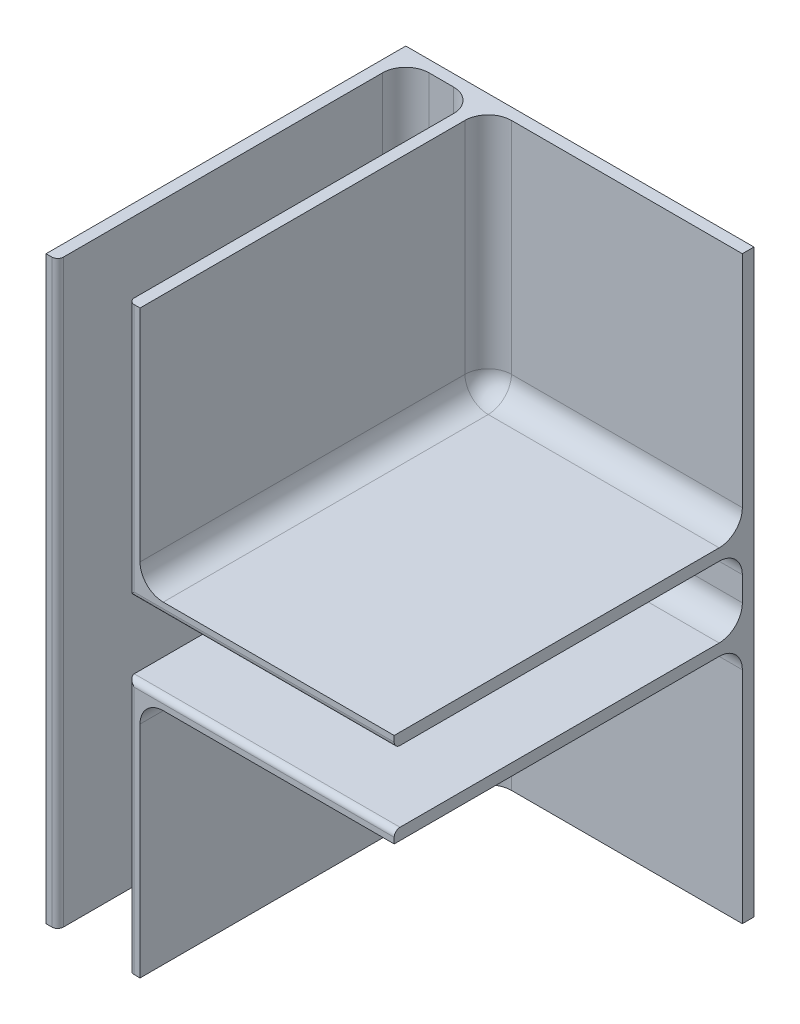
ISO-10303-21;
HEADER;
FILE_DESCRIPTION(('STEP AP214'),'2;1');
FILE_NAME('part.step','',(''),(''),'','','');
FILE_SCHEMA(('AUTOMOTIVE_DESIGN { 1 0 10303 214 1 1 1 1 }'));
ENDSEC;
DATA;
#1=APPLICATION_CONTEXT('core data for automotive mechanical design processes');
#2=APPLICATION_PROTOCOL_DEFINITION('international standard','automotive_design',2000,#1);
#3=PRODUCT_CONTEXT('',#1,'mechanical');
#4=PRODUCT('Part','Part','',(#3));
#5=PRODUCT_RELATED_PRODUCT_CATEGORY('part','',(#4));
#6=PRODUCT_DEFINITION_FORMATION('','',#4);
#7=PRODUCT_DEFINITION_CONTEXT('part definition',#1,'design');
#8=PRODUCT_DEFINITION('design','',#6,#7);
#9=PRODUCT_DEFINITION_SHAPE('','',#8);
#10=(LENGTH_UNIT() NAMED_UNIT(*) SI_UNIT(.MILLI.,.METRE.));
#11=(NAMED_UNIT(*) PLANE_ANGLE_UNIT() SI_UNIT($,.RADIAN.));
#12=(NAMED_UNIT(*) SI_UNIT($,.STERADIAN.) SOLID_ANGLE_UNIT());
#13=UNCERTAINTY_MEASURE_WITH_UNIT(LENGTH_MEASURE(1.E-05),#10,'distance_accuracy_value','');
#14=(GEOMETRIC_REPRESENTATION_CONTEXT(3) GLOBAL_UNCERTAINTY_ASSIGNED_CONTEXT((#13)) GLOBAL_UNIT_ASSIGNED_CONTEXT((#10,
#11,#12)) REPRESENTATION_CONTEXT('',''));
#15=CARTESIAN_POINT('',(0.,0.,0.));
#16=DIRECTION('',(0.,0.,1.));
#17=DIRECTION('',(1.,0.,0.));
#18=AXIS2_PLACEMENT_3D('',#15,#16,#17);
#19=CARTESIAN_POINT('',(0.,0.,1.));
#20=DIRECTION('',(0.,0.,-1.));
#21=DIRECTION('',(-1.,0.,0.));
#22=AXIS2_PLACEMENT_3D('',#19,#20,#21);
#23=PLANE('',#22);
#24=DIRECTION('',(-1.,0.,0.));
#25=VECTOR('',#24,1.);
#26=CARTESIAN_POINT('',(0.,50.,1.));
#27=LINE('',#26,#25);
#28=CARTESIAN_POINT('',(5.1,50.,1.));
#29=VERTEX_POINT('',#28);
#30=CARTESIAN_POINT('',(3.,50.,1.));
#31=VERTEX_POINT('',#30);
#32=EDGE_CURVE('E319',#29,#31,#27,.T.);
#33=ORIENTED_EDGE('',*,*,#32,.T.);
#34=DIRECTION('',(0.,1.,0.));
#35=VECTOR('',#34,1.);
#36=CARTESIAN_POINT('',(3.00000000000001,0.,1.));
#37=LINE('',#36,#35);
#38=CARTESIAN_POINT('',(3.00000000000001,0.,1.));
#39=VERTEX_POINT('',#38);
#40=EDGE_CURVE('E355',#31,#39,#37,.F.);
#41=ORIENTED_EDGE('',*,*,#40,.T.);
#42=DIRECTION('',(1.,0.,0.));
#43=VECTOR('',#42,1.);
#44=CARTESIAN_POINT('',(0.,0.,1.));
#45=LINE('',#44,#43);
#46=CARTESIAN_POINT('',(5.1,0.,1.));
#47=VERTEX_POINT('',#46);
#48=EDGE_CURVE('E314',#39,#47,#45,.T.);
#49=ORIENTED_EDGE('',*,*,#48,.T.);
#50=DIRECTION('',(0.,-1.,0.));
#51=VECTOR('',#50,1.);
#52=CARTESIAN_POINT('',(5.1,21.95,1.));
#53=LINE('',#52,#51);
#54=CARTESIAN_POINT('',(5.1,23.95,1.));
#55=VERTEX_POINT('',#54);
#56=EDGE_CURVE('E353',#47,#55,#53,.F.);
#57=ORIENTED_EDGE('',*,*,#56,.T.);
#58=DIRECTION('',(-1.,0.,0.));
#59=VECTOR('',#58,1.);
#60=CARTESIAN_POINT('',(30.,23.95,1.));
#61=LINE('',#60,#59);
#62=CARTESIAN_POINT('',(30.,23.95,1.));
#63=VERTEX_POINT('',#62);
#64=EDGE_CURVE('E351',#55,#63,#61,.F.);
#65=ORIENTED_EDGE('',*,*,#64,.T.);
#66=DIRECTION('',(0.,1.,0.));
#67=VECTOR('',#66,1.);
#68=CARTESIAN_POINT('',(30.,0.,1.));
#69=LINE('',#68,#67);
#70=CARTESIAN_POINT('',(30.,26.05,1.));
#71=VERTEX_POINT('',#70);
#72=EDGE_CURVE('E320',#63,#71,#69,.T.);
#73=ORIENTED_EDGE('',*,*,#72,.T.);
#74=DIRECTION('',(1.,0.,0.));
#75=VECTOR('',#74,1.);
#76=CARTESIAN_POINT('',(7.1,26.05,1.));
#77=LINE('',#76,#75);
#78=CARTESIAN_POINT('',(5.1,26.05,1.));
#79=VERTEX_POINT('',#78);
#80=EDGE_CURVE('E347',#71,#79,#77,.F.);
#81=ORIENTED_EDGE('',*,*,#80,.T.);
#82=DIRECTION('',(0.,-1.,0.));
#83=VECTOR('',#82,1.);
#84=CARTESIAN_POINT('',(5.1,50.,1.));
#85=LINE('',#84,#83);
#86=EDGE_CURVE('E349',#79,#29,#85,.F.);
#87=ORIENTED_EDGE('',*,*,#86,.T.);
#88=EDGE_LOOP('',(#33,#41,#49,#57,#65,#73,#81,#87));
#89=FACE_BOUND('',#88,.T.);
#90=ADVANCED_FACE('F33',(#89),#23,.F.);
#91=CARTESIAN_POINT('',(30.,50.,1.));
#92=VERTEX_POINT('',#91);
#93=CARTESIAN_POINT('',(10.1,50.,1.));
#94=VERTEX_POINT('',#93);
#95=EDGE_CURVE('E322',#92,#94,#27,.T.);
#96=ORIENTED_EDGE('',*,*,#95,.T.);
#97=DIRECTION('',(0.,1.,0.));
#98=VECTOR('',#97,1.);
#99=CARTESIAN_POINT('',(10.1,29.05,1.));
#100=LINE('',#99,#98);
#101=CARTESIAN_POINT('',(10.1,31.05,1.));
#102=VERTEX_POINT('',#101);
#103=EDGE_CURVE('E373',#94,#102,#100,.F.);
#104=ORIENTED_EDGE('',*,*,#103,.T.);
#105=DIRECTION('',(-1.,0.,0.));
#106=VECTOR('',#105,1.);
#107=CARTESIAN_POINT('',(30.,31.05,1.));
#108=LINE('',#107,#106);
#109=CARTESIAN_POINT('',(30.,31.05,1.));
#110=VERTEX_POINT('',#109);
#111=EDGE_CURVE('E371',#102,#110,#108,.F.);
#112=ORIENTED_EDGE('',*,*,#111,.T.);
#113=EDGE_CURVE('E321',#110,#92,#69,.T.);
#114=ORIENTED_EDGE('',*,*,#113,.T.);
#115=EDGE_LOOP('',(#96,#104,#112,#114));
#116=FACE_BOUND('',#115,.T.);
#117=ADVANCED_FACE('F577',(#116),#23,.F.);
#118=DIRECTION('',(1.,0.,0.));
#119=VECTOR('',#118,1.);
#120=CARTESIAN_POINT('',(8.1,18.95,1.));
#121=LINE('',#120,#119);
#122=CARTESIAN_POINT('',(30.,18.95,1.));
#123=VERTEX_POINT('',#122);
#124=CARTESIAN_POINT('',(10.1,18.95,1.));
#125=VERTEX_POINT('',#124);
#126=EDGE_CURVE('E390',#123,#125,#121,.F.);
#127=ORIENTED_EDGE('',*,*,#126,.T.);
#128=DIRECTION('',(0.,1.,0.));
#129=VECTOR('',#128,1.);
#130=CARTESIAN_POINT('',(10.1,0.,1.));
#131=LINE('',#130,#129);
#132=CARTESIAN_POINT('',(10.1,0.,1.));
#133=VERTEX_POINT('',#132);
#134=EDGE_CURVE('E392',#125,#133,#131,.F.);
#135=ORIENTED_EDGE('',*,*,#134,.T.);
#136=CARTESIAN_POINT('',(30.,0.,1.));
#137=VERTEX_POINT('',#136);
#138=EDGE_CURVE('E312',#133,#137,#45,.T.);
#139=ORIENTED_EDGE('',*,*,#138,.T.);
#140=EDGE_CURVE('E316',#137,#123,#69,.T.);
#141=ORIENTED_EDGE('',*,*,#140,.T.);
#142=EDGE_LOOP('',(#127,#135,#139,#141));
#143=FACE_BOUND('',#142,.T.);
#144=ADVANCED_FACE('F545',(#143),#23,.F.);
#145=CARTESIAN_POINT('',(0.,0.,1.));
#146=DIRECTION('',(1.,0.,0.));
#147=DIRECTION('',(0.,0.,-1.));
#148=AXIS2_PLACEMENT_3D('',#145,#146,#147);
#149=PLANE('',#148);
#150=DIRECTION('',(0.,-1.,0.));
#151=VECTOR('',#150,1.);
#152=CARTESIAN_POINT('',(0.,0.,0.));
#153=LINE('',#152,#151);
#154=CARTESIAN_POINT('',(0.,50.,0.));
#155=VERTEX_POINT('',#154);
#156=CARTESIAN_POINT('',(0.,0.,0.));
#157=VERTEX_POINT('',#156);
#158=EDGE_CURVE('E311',#155,#157,#153,.T.);
#159=ORIENTED_EDGE('',*,*,#158,.T.);
#160=DIRECTION('',(0.,0.,-1.));
#161=VECTOR('',#160,1.);
#162=CARTESIAN_POINT('',(0.,0.,1.));
#163=LINE('',#162,#161);
#164=CARTESIAN_POINT('',(0.,0.,31.));
#165=VERTEX_POINT('',#164);
#166=EDGE_CURVE('E341',#165,#157,#163,.T.);
#167=ORIENTED_EDGE('',*,*,#166,.F.);
#168=DIRECTION('',(0.,-1.,0.));
#169=VECTOR('',#168,1.);
#170=CARTESIAN_POINT('',(0.,50.,31.));
#171=LINE('',#170,#169);
#172=CARTESIAN_POINT('',(0.,50.,31.));
#173=VERTEX_POINT('',#172);
#174=EDGE_CURVE('E299',#173,#165,#171,.T.);
#175=ORIENTED_EDGE('',*,*,#174,.F.);
#176=DIRECTION('',(0.,0.,-1.));
#177=VECTOR('',#176,1.);
#178=CARTESIAN_POINT('',(0.,50.,1.));
#179=LINE('',#178,#177);
#180=EDGE_CURVE('E325',#173,#155,#179,.T.);
#181=ORIENTED_EDGE('',*,*,#180,.T.);
#182=EDGE_LOOP('',(#159,#167,#175,#181));
#183=FACE_BOUND('',#182,.T.);
#184=ADVANCED_FACE('F585',(#183),#149,.F.);
#185=CARTESIAN_POINT('',(0.,0.,1.));
#186=DIRECTION('',(0.,1.,0.));
#187=DIRECTION('',(0.,0.,1.));
#188=AXIS2_PLACEMENT_3D('',#185,#186,#187);
#189=PLANE('',#188);
#190=DIRECTION('',(0.,0.,-1.));
#191=VECTOR('',#190,1.);
#192=CARTESIAN_POINT('',(1.00000000000001,0.,31.));
#193=LINE('',#192,#191);
#194=CARTESIAN_POINT('',(1.00000000000001,0.,30.5));
#195=VERTEX_POINT('',#194);
#196=CARTESIAN_POINT('',(1.00000000000001,0.,3.));
#197=VERTEX_POINT('',#196);
#198=EDGE_CURVE('E309',#195,#197,#193,.T.);
#199=ORIENTED_EDGE('',*,*,#198,.F.);
#200=CARTESIAN_POINT('',(0.500000000000006,0.,30.5));
#201=DIRECTION('',(0.,1.,0.));
#202=DIRECTION('',(0.,0.,1.));
#203=AXIS2_PLACEMENT_3D('',#200,#201,#202);
#204=CIRCLE('',#203,0.5);
#205=CARTESIAN_POINT('',(0.500000000000006,0.,31.));
#206=VERTEX_POINT('',#205);
#207=EDGE_CURVE('E453',#195,#206,#204,.F.);
#208=ORIENTED_EDGE('',*,*,#207,.T.);
#209=DIRECTION('',(1.,0.,0.));
#210=VECTOR('',#209,1.);
#211=CARTESIAN_POINT('',(0.,0.,31.));
#212=LINE('',#211,#210);
#213=EDGE_CURVE('E302',#165,#206,#212,.T.);
#214=ORIENTED_EDGE('',*,*,#213,.F.);
#215=ORIENTED_EDGE('',*,*,#166,.T.);
#216=DIRECTION('',(1.,0.,0.));
#217=VECTOR('',#216,1.);
#218=CARTESIAN_POINT('',(0.,0.,0.));
#219=LINE('',#218,#217);
#220=CARTESIAN_POINT('',(30.,0.,0.));
#221=VERTEX_POINT('',#220);
#222=EDGE_CURVE('E328',#157,#221,#219,.T.);
#223=ORIENTED_EDGE('',*,*,#222,.T.);
#224=DIRECTION('',(0.,0.,-1.));
#225=VECTOR('',#224,1.);
#226=CARTESIAN_POINT('',(30.,0.,1.));
#227=LINE('',#226,#225);
#228=EDGE_CURVE('E338',#137,#221,#227,.T.);
#229=ORIENTED_EDGE('',*,*,#228,.F.);
#230=ORIENTED_EDGE('',*,*,#138,.F.);
#231=CARTESIAN_POINT('',(10.1,0.,3.));
#232=DIRECTION('',(0.,1.,0.));
#233=DIRECTION('',(0.,0.,1.));
#234=AXIS2_PLACEMENT_3D('',#231,#232,#233);
#235=CIRCLE('',#234,2.);
#236=CARTESIAN_POINT('',(8.10000000000001,0.,3.));
#237=VERTEX_POINT('',#236);
#238=EDGE_CURVE('E416',#133,#237,#235,.T.);
#239=ORIENTED_EDGE('',*,*,#238,.T.);
#240=DIRECTION('',(0.,0.,-1.));
#241=VECTOR('',#240,1.);
#242=CARTESIAN_POINT('',(8.10000000000001,0.,31.));
#243=LINE('',#242,#241);
#244=CARTESIAN_POINT('',(8.10000000000001,0.,31.));
#245=VERTEX_POINT('',#244);
#246=EDGE_CURVE('E294',#245,#237,#243,.T.);
#247=ORIENTED_EDGE('',*,*,#246,.F.);
#248=DIRECTION('',(1.,0.,0.));
#249=VECTOR('',#248,1.);
#250=CARTESIAN_POINT('',(7.1,0.,31.));
#251=LINE('',#250,#249);
#252=CARTESIAN_POINT('',(7.6,0.,31.));
#253=VERTEX_POINT('',#252);
#254=EDGE_CURVE('E277',#253,#245,#251,.T.);
#255=ORIENTED_EDGE('',*,*,#254,.F.);
#256=CARTESIAN_POINT('',(7.6,0.,30.5));
#257=DIRECTION('',(0.,1.,0.));
#258=DIRECTION('',(0.,0.,1.));
#259=AXIS2_PLACEMENT_3D('',#256,#257,#258);
#260=CIRCLE('',#259,0.5);
#261=CARTESIAN_POINT('',(7.1,0.,30.5));
#262=VERTEX_POINT('',#261);
#263=EDGE_CURVE('E451',#253,#262,#260,.F.);
#264=ORIENTED_EDGE('',*,*,#263,.T.);
#265=DIRECTION('',(0.,0.,-1.));
#266=VECTOR('',#265,1.);
#267=CARTESIAN_POINT('',(7.1,0.,31.));
#268=LINE('',#267,#266);
#269=CARTESIAN_POINT('',(7.1,0.,3.));
#270=VERTEX_POINT('',#269);
#271=EDGE_CURVE('E297',#262,#270,#268,.T.);
#272=ORIENTED_EDGE('',*,*,#271,.T.);
#273=CARTESIAN_POINT('',(5.1,0.,3.));
#274=DIRECTION('',(0.,1.,0.));
#275=DIRECTION('',(0.,0.,1.));
#276=AXIS2_PLACEMENT_3D('',#273,#274,#275);
#277=CIRCLE('',#276,2.);
#278=EDGE_CURVE('E404',#270,#47,#277,.T.);
#279=ORIENTED_EDGE('',*,*,#278,.T.);
#280=ORIENTED_EDGE('',*,*,#48,.F.);
#281=CARTESIAN_POINT('',(3.00000000000001,0.,3.));
#282=DIRECTION('',(0.,1.,0.));
#283=DIRECTION('',(0.,0.,1.));
#284=AXIS2_PLACEMENT_3D('',#281,#282,#283);
#285=CIRCLE('',#284,2.);
#286=EDGE_CURVE('E401',#39,#197,#285,.T.);
#287=ORIENTED_EDGE('',*,*,#286,.T.);
#288=EDGE_LOOP('',(#199,#208,#214,#215,#223,#229,#230,#239,#247,#255,#264,#272,#279,#280,#287));
#289=FACE_BOUND('',#288,.T.);
#290=ADVANCED_FACE('F555',(#289),#189,.F.);
#291=CARTESIAN_POINT('',(30.,0.,1.));
#292=DIRECTION('',(-1.,0.,0.));
#293=DIRECTION('',(0.,0.,1.));
#294=AXIS2_PLACEMENT_3D('',#291,#292,#293);
#295=PLANE('',#294);
#296=DIRECTION('',(0.,0.,-1.));
#297=VECTOR('',#296,1.);
#298=CARTESIAN_POINT('',(30.,21.95,31.));
#299=LINE('',#298,#297);
#300=CARTESIAN_POINT('',(30.,21.95,30.5));
#301=VERTEX_POINT('',#300);
#302=CARTESIAN_POINT('',(30.,21.95,3.));
#303=VERTEX_POINT('',#302);
#304=EDGE_CURVE('E289',#301,#303,#299,.T.);
#305=ORIENTED_EDGE('',*,*,#304,.F.);
#306=CARTESIAN_POINT('',(30.,21.45,30.5));
#307=DIRECTION('',(-1.,0.,0.));
#308=DIRECTION('',(0.,0.,1.));
#309=AXIS2_PLACEMENT_3D('',#306,#307,#308);
#310=CIRCLE('',#309,0.5);
#311=CARTESIAN_POINT('',(30.,21.45,31.));
#312=VERTEX_POINT('',#311);
#313=EDGE_CURVE('E466',#301,#312,#310,.F.);
#314=ORIENTED_EDGE('',*,*,#313,.T.);
#315=DIRECTION('',(0.,1.,0.));
#316=VECTOR('',#315,1.);
#317=CARTESIAN_POINT('',(30.,21.95,31.));
#318=LINE('',#317,#316);
#319=CARTESIAN_POINT('',(30.,20.95,31.));
#320=VERTEX_POINT('',#319);
#321=EDGE_CURVE('E284',#320,#312,#318,.T.);
#322=ORIENTED_EDGE('',*,*,#321,.F.);
#323=DIRECTION('',(0.,0.,-1.));
#324=VECTOR('',#323,1.);
#325=CARTESIAN_POINT('',(30.,20.95,31.));
#326=LINE('',#325,#324);
#327=CARTESIAN_POINT('',(30.,20.95,3.));
#328=VERTEX_POINT('',#327);
#329=EDGE_CURVE('E291',#320,#328,#326,.T.);
#330=ORIENTED_EDGE('',*,*,#329,.T.);
#331=CARTESIAN_POINT('',(30.,18.95,3.));
#332=DIRECTION('',(-1.,0.,0.));
#333=DIRECTION('',(0.,0.,1.));
#334=AXIS2_PLACEMENT_3D('',#331,#332,#333);
#335=CIRCLE('',#334,2.);
#336=EDGE_CURVE('E418',#328,#123,#335,.T.);
#337=ORIENTED_EDGE('',*,*,#336,.T.);
#338=ORIENTED_EDGE('',*,*,#140,.F.);
#339=ORIENTED_EDGE('',*,*,#228,.T.);
#340=DIRECTION('',(0.,1.,0.));
#341=VECTOR('',#340,1.);
#342=CARTESIAN_POINT('',(30.,0.,0.));
#343=LINE('',#342,#341);
#344=CARTESIAN_POINT('',(30.,50.,0.));
#345=VERTEX_POINT('',#344);
#346=EDGE_CURVE('E330',#221,#345,#343,.T.);
#347=ORIENTED_EDGE('',*,*,#346,.T.);
#348=DIRECTION('',(0.,0.,-1.));
#349=VECTOR('',#348,1.);
#350=CARTESIAN_POINT('',(30.,50.,1.));
#351=LINE('',#350,#349);
#352=EDGE_CURVE('E335',#92,#345,#351,.T.);
#353=ORIENTED_EDGE('',*,*,#352,.F.);
#354=ORIENTED_EDGE('',*,*,#113,.F.);
#355=CARTESIAN_POINT('',(30.,31.05,3.));
#356=DIRECTION('',(-1.,0.,0.));
#357=DIRECTION('',(0.,0.,1.));
#358=AXIS2_PLACEMENT_3D('',#355,#356,#357);
#359=CIRCLE('',#358,2.);
#360=CARTESIAN_POINT('',(30.,29.05,3.));
#361=VERTEX_POINT('',#360);
#362=EDGE_CURVE('E255',#110,#361,#359,.T.);
#363=ORIENTED_EDGE('',*,*,#362,.T.);
#364=DIRECTION('',(0.,0.,-1.));
#365=VECTOR('',#364,1.);
#366=CARTESIAN_POINT('',(30.,29.05,31.));
#367=LINE('',#366,#365);
#368=CARTESIAN_POINT('',(30.,29.05,31.));
#369=VERTEX_POINT('',#368);
#370=EDGE_CURVE('E250',#369,#361,#367,.T.);
#371=ORIENTED_EDGE('',*,*,#370,.F.);
#372=DIRECTION('',(0.,1.,0.));
#373=VECTOR('',#372,1.);
#374=CARTESIAN_POINT('',(30.,28.05,31.));
#375=LINE('',#374,#373);
#376=CARTESIAN_POINT('',(30.,28.55,31.));
#377=VERTEX_POINT('',#376);
#378=EDGE_CURVE('E238',#377,#369,#375,.T.);
#379=ORIENTED_EDGE('',*,*,#378,.F.);
#380=CARTESIAN_POINT('',(30.,28.55,30.5));
#381=DIRECTION('',(-1.,0.,0.));
#382=DIRECTION('',(0.,0.,1.));
#383=AXIS2_PLACEMENT_3D('',#380,#381,#382);
#384=CIRCLE('',#383,0.5);
#385=CARTESIAN_POINT('',(30.,28.05,30.5));
#386=VERTEX_POINT('',#385);
#387=EDGE_CURVE('E464',#377,#386,#384,.F.);
#388=ORIENTED_EDGE('',*,*,#387,.T.);
#389=DIRECTION('',(0.,0.,-1.));
#390=VECTOR('',#389,1.);
#391=CARTESIAN_POINT('',(30.,28.05,31.));
#392=LINE('',#391,#390);
#393=CARTESIAN_POINT('',(30.,28.05,3.));
#394=VERTEX_POINT('',#393);
#395=EDGE_CURVE('E258',#386,#394,#392,.T.);
#396=ORIENTED_EDGE('',*,*,#395,.T.);
#397=CARTESIAN_POINT('',(30.,26.05,3.));
#398=DIRECTION('',(-1.,0.,0.));
#399=DIRECTION('',(0.,0.,1.));
#400=AXIS2_PLACEMENT_3D('',#397,#398,#399);
#401=CIRCLE('',#400,2.);
#402=EDGE_CURVE('E412',#394,#71,#401,.T.);
#403=ORIENTED_EDGE('',*,*,#402,.T.);
#404=ORIENTED_EDGE('',*,*,#72,.F.);
#405=CARTESIAN_POINT('',(30.,23.95,3.));
#406=DIRECTION('',(-1.,0.,0.));
#407=DIRECTION('',(0.,0.,1.));
#408=AXIS2_PLACEMENT_3D('',#405,#406,#407);
#409=CIRCLE('',#408,2.);
#410=EDGE_CURVE('E409',#63,#303,#409,.T.);
#411=ORIENTED_EDGE('',*,*,#410,.T.);
#412=EDGE_LOOP('',(#305,#314,#322,#330,#337,#338,#339,#347,#353,#354,#363,#371,#379,#388,#396,
#403,#404,#411));
#413=FACE_BOUND('',#412,.T.);
#414=ADVANCED_FACE('F252',(#413),#295,.F.);
#415=CARTESIAN_POINT('',(0.,50.,1.));
#416=DIRECTION('',(0.,-1.,0.));
#417=DIRECTION('',(0.,0.,-1.));
#418=AXIS2_PLACEMENT_3D('',#415,#416,#417);
#419=PLANE('',#418);
#420=DIRECTION('',(-1.,0.,0.));
#421=VECTOR('',#420,1.);
#422=CARTESIAN_POINT('',(0.,50.,31.));
#423=LINE('',#422,#421);
#424=CARTESIAN_POINT('',(0.5,50.,31.));
#425=VERTEX_POINT('',#424);
#426=EDGE_CURVE('E305',#425,#173,#423,.T.);
#427=ORIENTED_EDGE('',*,*,#426,.F.);
#428=CARTESIAN_POINT('',(0.5,50.,30.5));
#429=DIRECTION('',(0.,-1.,0.));
#430=DIRECTION('',(0.,0.,-1.));
#431=AXIS2_PLACEMENT_3D('',#428,#429,#430);
#432=CIRCLE('',#431,0.5);
#433=CARTESIAN_POINT('',(1.,50.,30.5));
#434=VERTEX_POINT('',#433);
#435=EDGE_CURVE('E447',#425,#434,#432,.F.);
#436=ORIENTED_EDGE('',*,*,#435,.T.);
#437=DIRECTION('',(0.,0.,-1.));
#438=VECTOR('',#437,1.);
#439=CARTESIAN_POINT('',(1.,50.,31.));
#440=LINE('',#439,#438);
#441=CARTESIAN_POINT('',(1.,50.,3.));
#442=VERTEX_POINT('',#441);
#443=EDGE_CURVE('E307',#434,#442,#440,.T.);
#444=ORIENTED_EDGE('',*,*,#443,.T.);
#445=CARTESIAN_POINT('',(3.,50.,3.));
#446=DIRECTION('',(0.,-1.,0.));
#447=DIRECTION('',(0.,0.,-1.));
#448=AXIS2_PLACEMENT_3D('',#445,#446,#447);
#449=CIRCLE('',#448,2.);
#450=EDGE_CURVE('E399',#442,#31,#449,.T.);
#451=ORIENTED_EDGE('',*,*,#450,.T.);
#452=ORIENTED_EDGE('',*,*,#32,.F.);
#453=CARTESIAN_POINT('',(5.1,50.,3.));
#454=DIRECTION('',(0.,-1.,0.));
#455=DIRECTION('',(0.,0.,-1.));
#456=AXIS2_PLACEMENT_3D('',#453,#454,#455);
#457=CIRCLE('',#456,2.);
#458=CARTESIAN_POINT('',(7.1,50.,3.));
#459=VERTEX_POINT('',#458);
#460=EDGE_CURVE('E394',#29,#459,#457,.T.);
#461=ORIENTED_EDGE('',*,*,#460,.T.);
#462=DIRECTION('',(0.,0.,-1.));
#463=VECTOR('',#462,1.);
#464=CARTESIAN_POINT('',(7.1,50.,31.));
#465=LINE('',#464,#463);
#466=CARTESIAN_POINT('',(7.1,50.,30.5));
#467=VERTEX_POINT('',#466);
#468=EDGE_CURVE('E270',#467,#459,#465,.T.);
#469=ORIENTED_EDGE('',*,*,#468,.F.);
#470=CARTESIAN_POINT('',(7.6,50.,30.5));
#471=DIRECTION('',(0.,-1.,0.));
#472=DIRECTION('',(0.,0.,-1.));
#473=AXIS2_PLACEMENT_3D('',#470,#471,#472);
#474=CIRCLE('',#473,0.5);
#475=CARTESIAN_POINT('',(7.6,50.,31.));
#476=VERTEX_POINT('',#475);
#477=EDGE_CURVE('E445',#467,#476,#474,.F.);
#478=ORIENTED_EDGE('',*,*,#477,.T.);
#479=DIRECTION('',(-1.,0.,0.));
#480=VECTOR('',#479,1.);
#481=CARTESIAN_POINT('',(7.1,50.,31.));
#482=LINE('',#481,#480);
#483=CARTESIAN_POINT('',(8.1,50.,31.));
#484=VERTEX_POINT('',#483);
#485=EDGE_CURVE('E266',#484,#476,#482,.T.);
#486=ORIENTED_EDGE('',*,*,#485,.F.);
#487=DIRECTION('',(0.,0.,-1.));
#488=VECTOR('',#487,1.);
#489=CARTESIAN_POINT('',(8.1,50.,31.));
#490=LINE('',#489,#488);
#491=CARTESIAN_POINT('',(8.1,50.,3.));
#492=VERTEX_POINT('',#491);
#493=EDGE_CURVE('E259',#484,#492,#490,.T.);
#494=ORIENTED_EDGE('',*,*,#493,.T.);
#495=CARTESIAN_POINT('',(10.1,50.,3.));
#496=DIRECTION('',(0.,-1.,0.));
#497=DIRECTION('',(0.,0.,-1.));
#498=AXIS2_PLACEMENT_3D('',#495,#496,#497);
#499=CIRCLE('',#498,2.);
#500=EDGE_CURVE('E406',#492,#94,#499,.T.);
#501=ORIENTED_EDGE('',*,*,#500,.T.);
#502=ORIENTED_EDGE('',*,*,#95,.F.);
#503=ORIENTED_EDGE('',*,*,#352,.T.);
#504=DIRECTION('',(-1.,0.,0.));
#505=VECTOR('',#504,1.);
#506=CARTESIAN_POINT('',(0.,50.,0.));
#507=LINE('',#506,#505);
#508=EDGE_CURVE('E315',#345,#155,#507,.T.);
#509=ORIENTED_EDGE('',*,*,#508,.T.);
#510=ORIENTED_EDGE('',*,*,#180,.F.);
#511=EDGE_LOOP('',(#427,#436,#444,#451,#452,#461,#469,#478,#486,#494,#501,#502,#503,#509,#510));
#512=FACE_BOUND('',#511,.T.);
#513=ADVANCED_FACE('F486',(#512),#419,.F.);
#514=CARTESIAN_POINT('',(0.,0.,0.));
#515=DIRECTION('',(0.,0.,-1.));
#516=DIRECTION('',(-1.,0.,0.));
#517=AXIS2_PLACEMENT_3D('',#514,#515,#516);
#518=PLANE('',#517);
#519=ORIENTED_EDGE('',*,*,#158,.F.);
#520=ORIENTED_EDGE('',*,*,#508,.F.);
#521=ORIENTED_EDGE('',*,*,#346,.F.);
#522=ORIENTED_EDGE('',*,*,#222,.F.);
#523=EDGE_LOOP('',(#519,#520,#521,#522));
#524=FACE_BOUND('',#523,.T.);
#525=ADVANCED_FACE('F788',(#524),#518,.T.);
#526=CARTESIAN_POINT('',(1.,50.,31.));
#527=DIRECTION('',(-1.,0.,0.));
#528=DIRECTION('',(0.,-1.,0.));
#529=AXIS2_PLACEMENT_3D('',#526,#527,#528);
#530=PLANE('',#529);
#531=ORIENTED_EDGE('',*,*,#443,.F.);
#532=DIRECTION('',(0.,1.,0.));
#533=VECTOR('',#532,1.);
#534=CARTESIAN_POINT('',(1.00000000000001,0.,30.5));
#535=LINE('',#534,#533);
#536=EDGE_CURVE('E449',#434,#195,#535,.F.);
#537=ORIENTED_EDGE('',*,*,#536,.T.);
#538=ORIENTED_EDGE('',*,*,#198,.T.);
#539=DIRECTION('',(0.,1.,0.));
#540=VECTOR('',#539,1.);
#541=CARTESIAN_POINT('',(1.,50.,3.));
#542=LINE('',#541,#540);
#543=EDGE_CURVE('E365',#197,#442,#542,.T.);
#544=ORIENTED_EDGE('',*,*,#543,.T.);
#545=EDGE_LOOP('',(#531,#537,#538,#544));
#546=FACE_BOUND('',#545,.T.);
#547=ADVANCED_FACE('F777',(#546),#530,.F.);
#548=CARTESIAN_POINT('',(0.,0.,31.));
#549=DIRECTION('',(0.,0.,1.));
#550=DIRECTION('',(1.,0.,0.));
#551=AXIS2_PLACEMENT_3D('',#548,#549,#550);
#552=PLANE('',#551);
#553=ORIENTED_EDGE('',*,*,#213,.T.);
#554=DIRECTION('',(0.,1.,0.));
#555=VECTOR('',#554,1.);
#556=CARTESIAN_POINT('',(0.5,50.,31.));
#557=LINE('',#556,#555);
#558=EDGE_CURVE('E420',#206,#425,#557,.T.);
#559=ORIENTED_EDGE('',*,*,#558,.T.);
#560=ORIENTED_EDGE('',*,*,#426,.T.);
#561=ORIENTED_EDGE('',*,*,#174,.T.);
#562=EDGE_LOOP('',(#553,#559,#560,#561));
#563=FACE_BOUND('',#562,.T.);
#564=ADVANCED_FACE('F766',(#563),#552,.T.);
#565=CARTESIAN_POINT('',(7.1,0.,31.));
#566=DIRECTION('',(1.,0.,0.));
#567=DIRECTION('',(0.,1.,0.));
#568=AXIS2_PLACEMENT_3D('',#565,#566,#567);
#569=PLANE('',#568);
#570=ORIENTED_EDGE('',*,*,#271,.F.);
#571=DIRECTION('',(0.,-1.,0.));
#572=VECTOR('',#571,1.);
#573=CARTESIAN_POINT('',(7.1,0.,30.5));
#574=LINE('',#573,#572);
#575=CARTESIAN_POINT('',(7.1,21.95,30.5));
#576=VERTEX_POINT('',#575);
#577=EDGE_CURVE('E460',#262,#576,#574,.F.);
#578=ORIENTED_EDGE('',*,*,#577,.T.);
#579=DIRECTION('',(0.,0.,-1.));
#580=VECTOR('',#579,1.);
#581=CARTESIAN_POINT('',(7.1,21.95,31.));
#582=LINE('',#581,#580);
#583=CARTESIAN_POINT('',(7.1,21.95,3.));
#584=VERTEX_POINT('',#583);
#585=EDGE_CURVE('E287',#576,#584,#582,.T.);
#586=ORIENTED_EDGE('',*,*,#585,.T.);
#587=DIRECTION('',(0.,-1.,0.));
#588=VECTOR('',#587,1.);
#589=CARTESIAN_POINT('',(7.1,0.,3.));
#590=LINE('',#589,#588);
#591=EDGE_CURVE('E368',#584,#270,#590,.T.);
#592=ORIENTED_EDGE('',*,*,#591,.T.);
#593=EDGE_LOOP('',(#570,#578,#586,#592));
#594=FACE_BOUND('',#593,.T.);
#595=ADVANCED_FACE('F574',(#594),#569,.F.);
#596=CARTESIAN_POINT('',(8.10000000000001,0.,31.));
#597=DIRECTION('',(-1.,0.,0.));
#598=DIRECTION('',(0.,-1.,0.));
#599=AXIS2_PLACEMENT_3D('',#596,#597,#598);
#600=PLANE('',#599);
#601=DIRECTION('',(0.,1.,0.));
#602=VECTOR('',#601,1.);
#603=CARTESIAN_POINT('',(8.1,20.95,3.));
#604=LINE('',#603,#602);
#605=CARTESIAN_POINT('',(8.1,18.95,3.));
#606=VERTEX_POINT('',#605);
#607=EDGE_CURVE('E386',#237,#606,#604,.T.);
#608=ORIENTED_EDGE('',*,*,#607,.T.);
#609=DIRECTION('',(0.,0.,-1.));
#610=VECTOR('',#609,1.);
#611=CARTESIAN_POINT('',(8.1,18.95,31.));
#612=LINE('',#611,#610);
#613=CARTESIAN_POINT('',(8.1,18.95,31.));
#614=VERTEX_POINT('',#613);
#615=EDGE_CURVE('E388',#606,#614,#612,.F.);
#616=ORIENTED_EDGE('',*,*,#615,.T.);
#617=DIRECTION('',(0.,1.,0.));
#618=VECTOR('',#617,1.);
#619=CARTESIAN_POINT('',(8.10000000000001,0.,31.));
#620=LINE('',#619,#618);
#621=EDGE_CURVE('E279',#245,#614,#620,.T.);
#622=ORIENTED_EDGE('',*,*,#621,.F.);
#623=ORIENTED_EDGE('',*,*,#246,.T.);
#624=EDGE_LOOP('',(#608,#616,#622,#623));
#625=FACE_BOUND('',#624,.T.);
#626=ADVANCED_FACE('F559',(#625),#600,.F.);
#627=CARTESIAN_POINT('',(8.1,20.95,31.));
#628=DIRECTION('',(0.,1.,0.));
#629=DIRECTION('',(0.,0.,1.));
#630=AXIS2_PLACEMENT_3D('',#627,#628,#629);
#631=PLANE('',#630);
#632=DIRECTION('',(1.,0.,0.));
#633=VECTOR('',#632,1.);
#634=CARTESIAN_POINT('',(8.1,20.95,31.));
#635=LINE('',#634,#633);
#636=CARTESIAN_POINT('',(10.1,20.95,31.));
#637=VERTEX_POINT('',#636);
#638=EDGE_CURVE('E282',#637,#320,#635,.T.);
#639=ORIENTED_EDGE('',*,*,#638,.F.);
#640=DIRECTION('',(0.,0.,-1.));
#641=VECTOR('',#640,1.);
#642=CARTESIAN_POINT('',(10.1,20.95,1.));
#643=LINE('',#642,#641);
#644=CARTESIAN_POINT('',(10.1,20.95,3.));
#645=VERTEX_POINT('',#644);
#646=EDGE_CURVE('E383',#637,#645,#643,.T.);
#647=ORIENTED_EDGE('',*,*,#646,.T.);
#648=DIRECTION('',(1.,0.,0.));
#649=VECTOR('',#648,1.);
#650=CARTESIAN_POINT('',(30.,20.95,3.));
#651=LINE('',#650,#649);
#652=EDGE_CURVE('E381',#645,#328,#651,.T.);
#653=ORIENTED_EDGE('',*,*,#652,.T.);
#654=ORIENTED_EDGE('',*,*,#329,.F.);
#655=EDGE_LOOP('',(#639,#647,#653,#654));
#656=FACE_BOUND('',#655,.T.);
#657=ADVANCED_FACE('F565',(#656),#631,.F.);
#658=CARTESIAN_POINT('',(7.1,21.95,31.));
#659=DIRECTION('',(0.,-1.,0.));
#660=DIRECTION('',(0.,0.,-1.));
#661=AXIS2_PLACEMENT_3D('',#658,#659,#660);
#662=PLANE('',#661);
#663=ORIENTED_EDGE('',*,*,#585,.F.);
#664=DIRECTION('',(-1.,0.,0.));
#665=VECTOR('',#664,1.);
#666=CARTESIAN_POINT('',(7.1,21.95,30.5));
#667=LINE('',#666,#665);
#668=EDGE_CURVE('E462',#576,#301,#667,.F.);
#669=ORIENTED_EDGE('',*,*,#668,.T.);
#670=ORIENTED_EDGE('',*,*,#304,.T.);
#671=DIRECTION('',(-1.,0.,0.));
#672=VECTOR('',#671,1.);
#673=CARTESIAN_POINT('',(7.1,21.95,3.));
#674=LINE('',#673,#672);
#675=EDGE_CURVE('E375',#303,#584,#674,.T.);
#676=ORIENTED_EDGE('',*,*,#675,.T.);
#677=EDGE_LOOP('',(#663,#669,#670,#676));
#678=FACE_BOUND('',#677,.T.);
#679=ADVANCED_FACE('F567',(#678),#662,.F.);
#680=CARTESIAN_POINT('',(0.,0.,31.));
#681=DIRECTION('',(0.,0.,-1.));
#682=DIRECTION('',(-1.,0.,0.));
#683=AXIS2_PLACEMENT_3D('',#680,#681,#682);
#684=PLANE('',#683);
#685=DIRECTION('',(-1.,0.,0.));
#686=VECTOR('',#685,1.);
#687=CARTESIAN_POINT('',(0.,21.45,31.));
#688=LINE('',#687,#686);
#689=CARTESIAN_POINT('',(7.6,21.45,31.));
#690=VERTEX_POINT('',#689);
#691=EDGE_CURVE('E455',#312,#690,#688,.T.);
#692=ORIENTED_EDGE('',*,*,#691,.T.);
#693=DIRECTION('',(0.,-1.,0.));
#694=VECTOR('',#693,1.);
#695=CARTESIAN_POINT('',(7.6,0.,31.));
#696=LINE('',#695,#694);
#697=EDGE_CURVE('E457',#690,#253,#696,.T.);
#698=ORIENTED_EDGE('',*,*,#697,.T.);
#699=ORIENTED_EDGE('',*,*,#254,.T.);
#700=ORIENTED_EDGE('',*,*,#621,.T.);
#701=CARTESIAN_POINT('',(10.1,18.95,31.));
#702=DIRECTION('',(0.,0.,-1.));
#703=DIRECTION('',(-1.,0.,0.));
#704=AXIS2_PLACEMENT_3D('',#701,#702,#703);
#705=CIRCLE('',#704,2.);
#706=EDGE_CURVE('E414',#614,#637,#705,.T.);
#707=ORIENTED_EDGE('',*,*,#706,.T.);
#708=ORIENTED_EDGE('',*,*,#638,.T.);
#709=ORIENTED_EDGE('',*,*,#321,.T.);
#710=EDGE_LOOP('',(#692,#698,#699,#700,#707,#708,#709));
#711=FACE_BOUND('',#710,.T.);
#712=ADVANCED_FACE('F531',(#711),#684,.F.);
#713=CARTESIAN_POINT('',(7.1,50.,31.));
#714=DIRECTION('',(1.,0.,0.));
#715=DIRECTION('',(0.,1.,0.));
#716=AXIS2_PLACEMENT_3D('',#713,#714,#715);
#717=PLANE('',#716);
#718=DIRECTION('',(0.,0.,-1.));
#719=VECTOR('',#718,1.);
#720=CARTESIAN_POINT('',(7.1,28.05,31.));
#721=LINE('',#720,#719);
#722=CARTESIAN_POINT('',(7.1,28.05,30.5));
#723=VERTEX_POINT('',#722);
#724=CARTESIAN_POINT('',(7.1,28.05,3.));
#725=VERTEX_POINT('',#724);
#726=EDGE_CURVE('E275',#723,#725,#721,.T.);
#727=ORIENTED_EDGE('',*,*,#726,.F.);
#728=DIRECTION('',(0.,-1.,0.));
#729=VECTOR('',#728,1.);
#730=CARTESIAN_POINT('',(7.1,50.,30.5));
#731=LINE('',#730,#729);
#732=EDGE_CURVE('E11',#723,#467,#731,.F.);
#733=ORIENTED_EDGE('',*,*,#732,.T.);
#734=ORIENTED_EDGE('',*,*,#468,.T.);
#735=DIRECTION('',(0.,-1.,0.));
#736=VECTOR('',#735,1.);
#737=CARTESIAN_POINT('',(7.1,28.05,3.));
#738=LINE('',#737,#736);
#739=EDGE_CURVE('E344',#459,#725,#738,.T.);
#740=ORIENTED_EDGE('',*,*,#739,.T.);
#741=EDGE_LOOP('',(#727,#733,#734,#740));
#742=FACE_BOUND('',#741,.T.);
#743=ADVANCED_FACE('F483',(#742),#717,.F.);
#744=CARTESIAN_POINT('',(8.10000000000001,28.05,31.));
#745=DIRECTION('',(0.,1.,0.));
#746=DIRECTION('',(0.,0.,1.));
#747=AXIS2_PLACEMENT_3D('',#744,#745,#746);
#748=PLANE('',#747);
#749=ORIENTED_EDGE('',*,*,#395,.F.);
#750=DIRECTION('',(1.,0.,0.));
#751=VECTOR('',#750,1.);
#752=CARTESIAN_POINT('',(7.1,28.05,30.5));
#753=LINE('',#752,#751);
#754=EDGE_CURVE('E42',#386,#723,#753,.F.);
#755=ORIENTED_EDGE('',*,*,#754,.T.);
#756=ORIENTED_EDGE('',*,*,#726,.T.);
#757=DIRECTION('',(1.,0.,0.));
#758=VECTOR('',#757,1.);
#759=CARTESIAN_POINT('',(30.,28.05,3.));
#760=LINE('',#759,#758);
#761=EDGE_CURVE('E378',#725,#394,#760,.T.);
#762=ORIENTED_EDGE('',*,*,#761,.T.);
#763=EDGE_LOOP('',(#749,#755,#756,#762));
#764=FACE_BOUND('',#763,.T.);
#765=ADVANCED_FACE('F501',(#764),#748,.F.);
#766=CARTESIAN_POINT('',(8.1,29.05,31.));
#767=DIRECTION('',(0.,-1.,0.));
#768=DIRECTION('',(0.,0.,-1.));
#769=AXIS2_PLACEMENT_3D('',#766,#767,#768);
#770=PLANE('',#769);
#771=DIRECTION('',(-1.,0.,0.));
#772=VECTOR('',#771,1.);
#773=CARTESIAN_POINT('',(8.1,29.05,3.));
#774=LINE('',#773,#772);
#775=CARTESIAN_POINT('',(10.1,29.05,3.));
#776=VERTEX_POINT('',#775);
#777=EDGE_CURVE('E362',#361,#776,#774,.T.);
#778=ORIENTED_EDGE('',*,*,#777,.T.);
#779=DIRECTION('',(0.,0.,-1.));
#780=VECTOR('',#779,1.);
#781=CARTESIAN_POINT('',(10.1,29.05,31.));
#782=LINE('',#781,#780);
#783=CARTESIAN_POINT('',(10.1,29.05,31.));
#784=VERTEX_POINT('',#783);
#785=EDGE_CURVE('E263',#776,#784,#782,.F.);
#786=ORIENTED_EDGE('',*,*,#785,.T.);
#787=DIRECTION('',(-1.,0.,0.));
#788=VECTOR('',#787,1.);
#789=CARTESIAN_POINT('',(8.1,29.05,31.));
#790=LINE('',#789,#788);
#791=EDGE_CURVE('E242',#369,#784,#790,.T.);
#792=ORIENTED_EDGE('',*,*,#791,.F.);
#793=ORIENTED_EDGE('',*,*,#370,.T.);
#794=EDGE_LOOP('',(#778,#786,#792,#793));
#795=FACE_BOUND('',#794,.T.);
#796=ADVANCED_FACE('F261',(#795),#770,.F.);
#797=CARTESIAN_POINT('',(8.1,50.,31.));
#798=DIRECTION('',(-1.,0.,0.));
#799=DIRECTION('',(0.,-1.,0.));
#800=AXIS2_PLACEMENT_3D('',#797,#798,#799);
#801=PLANE('',#800);
#802=DIRECTION('',(0.,1.,0.));
#803=VECTOR('',#802,1.);
#804=CARTESIAN_POINT('',(8.1,50.,31.));
#805=LINE('',#804,#803);
#806=CARTESIAN_POINT('',(8.1,31.05,31.));
#807=VERTEX_POINT('',#806);
#808=EDGE_CURVE('E264',#807,#484,#805,.T.);
#809=ORIENTED_EDGE('',*,*,#808,.F.);
#810=DIRECTION('',(0.,0.,-1.));
#811=VECTOR('',#810,1.);
#812=CARTESIAN_POINT('',(8.1,31.05,1.));
#813=LINE('',#812,#811);
#814=CARTESIAN_POINT('',(8.1,31.05,3.));
#815=VERTEX_POINT('',#814);
#816=EDGE_CURVE('E359',#807,#815,#813,.T.);
#817=ORIENTED_EDGE('',*,*,#816,.T.);
#818=DIRECTION('',(0.,1.,0.));
#819=VECTOR('',#818,1.);
#820=CARTESIAN_POINT('',(8.1,50.,3.));
#821=LINE('',#820,#819);
#822=EDGE_CURVE('E357',#815,#492,#821,.T.);
#823=ORIENTED_EDGE('',*,*,#822,.T.);
#824=ORIENTED_EDGE('',*,*,#493,.F.);
#825=EDGE_LOOP('',(#809,#817,#823,#824));
#826=FACE_BOUND('',#825,.T.);
#827=ADVANCED_FACE('F721',(#826),#801,.F.);
#828=CARTESIAN_POINT('',(0.,0.,31.));
#829=DIRECTION('',(0.,0.,1.));
#830=DIRECTION('',(1.,0.,0.));
#831=AXIS2_PLACEMENT_3D('',#828,#829,#830);
#832=PLANE('',#831);
#833=DIRECTION('',(0.,-1.,0.));
#834=VECTOR('',#833,1.);
#835=CARTESIAN_POINT('',(7.6,28.05,31.));
#836=LINE('',#835,#834);
#837=CARTESIAN_POINT('',(7.6,28.55,31.));
#838=VERTEX_POINT('',#837);
#839=EDGE_CURVE('E57',#476,#838,#836,.T.);
#840=ORIENTED_EDGE('',*,*,#839,.T.);
#841=DIRECTION('',(1.,0.,0.));
#842=VECTOR('',#841,1.);
#843=CARTESIAN_POINT('',(30.,28.55,31.));
#844=LINE('',#843,#842);
#845=EDGE_CURVE('E245',#838,#377,#844,.T.);
#846=ORIENTED_EDGE('',*,*,#845,.T.);
#847=ORIENTED_EDGE('',*,*,#378,.T.);
#848=ORIENTED_EDGE('',*,*,#791,.T.);
#849=CARTESIAN_POINT('',(10.1,31.05,31.));
#850=DIRECTION('',(0.,0.,1.));
#851=DIRECTION('',(1.,0.,0.));
#852=AXIS2_PLACEMENT_3D('',#849,#850,#851);
#853=CIRCLE('',#852,2.);
#854=EDGE_CURVE('E397',#784,#807,#853,.F.);
#855=ORIENTED_EDGE('',*,*,#854,.T.);
#856=ORIENTED_EDGE('',*,*,#808,.T.);
#857=ORIENTED_EDGE('',*,*,#485,.T.);
#858=EDGE_LOOP('',(#840,#846,#847,#848,#855,#856,#857));
#859=FACE_BOUND('',#858,.T.);
#860=ADVANCED_FACE('F240',(#859),#832,.T.);
#861=CARTESIAN_POINT('',(8.10000000000001,26.05,3.));
#862=DIRECTION('',(-1.,0.,0.));
#863=DIRECTION('',(0.,0.,1.));
#864=AXIS2_PLACEMENT_3D('',#861,#862,#863);
#865=CYLINDRICAL_SURFACE('',#864,2.);
#866=ORIENTED_EDGE('',*,*,#402,.F.);
#867=ORIENTED_EDGE('',*,*,#761,.F.);
#868=CARTESIAN_POINT('',(5.1,26.05,3.));
#869=DIRECTION('',(-0.707106781186548,0.707106781186547,0.));
#870=DIRECTION('',(-0.707106781186547,-0.707106781186548,0.));
#871=AXIS2_PLACEMENT_3D('',#868,#869,#870);
#872=ELLIPSE('',#871,2.82842712474619,2.);
#873=EDGE_CURVE('E247',#79,#725,#872,.F.);
#874=ORIENTED_EDGE('',*,*,#873,.F.);
#875=ORIENTED_EDGE('',*,*,#80,.F.);
#876=EDGE_LOOP('',(#866,#867,#874,#875));
#877=FACE_BOUND('',#876,.T.);
#878=ADVANCED_FACE('F500',(#877),#865,.F.);
#879=CARTESIAN_POINT('',(5.1,50.,3.));
#880=DIRECTION('',(0.,1.,0.));
#881=DIRECTION('',(-1.,0.,0.));
#882=AXIS2_PLACEMENT_3D('',#879,#880,#881);
#883=CYLINDRICAL_SURFACE('',#882,2.);
#884=ORIENTED_EDGE('',*,*,#460,.F.);
#885=ORIENTED_EDGE('',*,*,#86,.F.);
#886=ORIENTED_EDGE('',*,*,#873,.T.);
#887=ORIENTED_EDGE('',*,*,#739,.F.);
#888=EDGE_LOOP('',(#884,#885,#886,#887));
#889=FACE_BOUND('',#888,.T.);
#890=ADVANCED_FACE('F494',(#889),#883,.F.);
#891=CARTESIAN_POINT('',(10.1,50.,3.));
#892=DIRECTION('',(0.,-1.,0.));
#893=DIRECTION('',(1.,0.,0.));
#894=AXIS2_PLACEMENT_3D('',#891,#892,#893);
#895=CYLINDRICAL_SURFACE('',#894,2.);
#896=ORIENTED_EDGE('',*,*,#500,.F.);
#897=ORIENTED_EDGE('',*,*,#822,.F.);
#898=CARTESIAN_POINT('',(10.1,31.05,3.));
#899=DIRECTION('',(0.,1.,0.));
#900=DIRECTION('',(0.,0.,1.));
#901=AXIS2_PLACEMENT_3D('',#898,#899,#900);
#902=CIRCLE('',#901,2.);
#903=EDGE_CURVE('E423',#102,#815,#902,.T.);
#904=ORIENTED_EDGE('',*,*,#903,.F.);
#905=ORIENTED_EDGE('',*,*,#103,.F.);
#906=EDGE_LOOP('',(#896,#897,#904,#905));
#907=FACE_BOUND('',#906,.T.);
#908=ADVANCED_FACE('F599',(#907),#895,.F.);
#909=CARTESIAN_POINT('',(8.1,31.05,3.));
#910=DIRECTION('',(1.,0.,0.));
#911=DIRECTION('',(0.,0.,-1.));
#912=AXIS2_PLACEMENT_3D('',#909,#910,#911);
#913=CYLINDRICAL_SURFACE('',#912,2.);
#914=ORIENTED_EDGE('',*,*,#362,.F.);
#915=ORIENTED_EDGE('',*,*,#111,.F.);
#916=CARTESIAN_POINT('',(10.1,31.05,3.));
#917=DIRECTION('',(1.,0.,0.));
#918=DIRECTION('',(0.,0.,-1.));
#919=AXIS2_PLACEMENT_3D('',#916,#917,#918);
#920=CIRCLE('',#919,2.);
#921=EDGE_CURVE('E426',#776,#102,#920,.T.);
#922=ORIENTED_EDGE('',*,*,#921,.F.);
#923=ORIENTED_EDGE('',*,*,#777,.F.);
#924=EDGE_LOOP('',(#914,#915,#922,#923));
#925=FACE_BOUND('',#924,.T.);
#926=ADVANCED_FACE('F610',(#925),#913,.F.);
#927=CARTESIAN_POINT('',(10.1,31.05,3.));
#928=DIRECTION('',(0.,0.,1.));
#929=DIRECTION('',(1.,0.,0.));
#930=AXIS2_PLACEMENT_3D('',#927,#928,#929);
#931=SPHERICAL_SURFACE('',#930,2.);
#932=ORIENTED_EDGE('',*,*,#921,.T.);
#933=ORIENTED_EDGE('',*,*,#903,.T.);
#934=CARTESIAN_POINT('',(10.1,31.05,3.));
#935=DIRECTION('',(0.,0.,1.));
#936=DIRECTION('',(1.,0.,0.));
#937=AXIS2_PLACEMENT_3D('',#934,#935,#936);
#938=CIRCLE('',#937,2.);
#939=EDGE_CURVE('E424',#776,#815,#938,.F.);
#940=ORIENTED_EDGE('',*,*,#939,.F.);
#941=EDGE_LOOP('',(#932,#933,#940));
#942=FACE_BOUND('',#941,.T.);
#943=ADVANCED_FACE('F606',(#942),#931,.F.);
#944=CARTESIAN_POINT('',(10.1,31.05,31.));
#945=DIRECTION('',(0.,0.,1.));
#946=DIRECTION('',(1.,0.,0.));
#947=AXIS2_PLACEMENT_3D('',#944,#945,#946);
#948=CYLINDRICAL_SURFACE('',#947,2.);
#949=ORIENTED_EDGE('',*,*,#854,.F.);
#950=ORIENTED_EDGE('',*,*,#785,.F.);
#951=ORIENTED_EDGE('',*,*,#939,.T.);
#952=ORIENTED_EDGE('',*,*,#816,.F.);
#953=EDGE_LOOP('',(#949,#950,#951,#952));
#954=FACE_BOUND('',#953,.T.);
#955=ADVANCED_FACE('F602',(#954),#948,.F.);
#956=CARTESIAN_POINT('',(3.,50.,3.));
#957=DIRECTION('',(0.,-1.,0.));
#958=DIRECTION('',(1.,0.,0.));
#959=AXIS2_PLACEMENT_3D('',#956,#957,#958);
#960=CYLINDRICAL_SURFACE('',#959,2.);
#961=ORIENTED_EDGE('',*,*,#286,.F.);
#962=ORIENTED_EDGE('',*,*,#40,.F.);
#963=ORIENTED_EDGE('',*,*,#450,.F.);
#964=ORIENTED_EDGE('',*,*,#543,.F.);
#965=EDGE_LOOP('',(#961,#962,#963,#964));
#966=FACE_BOUND('',#965,.T.);
#967=ADVANCED_FACE('F605',(#966),#960,.F.);
#968=CARTESIAN_POINT('',(7.1,23.95,3.));
#969=DIRECTION('',(1.,0.,0.));
#970=DIRECTION('',(0.,0.,-1.));
#971=AXIS2_PLACEMENT_3D('',#968,#969,#970);
#972=CYLINDRICAL_SURFACE('',#971,2.);
#973=ORIENTED_EDGE('',*,*,#410,.F.);
#974=ORIENTED_EDGE('',*,*,#64,.F.);
#975=CARTESIAN_POINT('',(5.1,23.95,3.));
#976=DIRECTION('',(0.707106781186547,0.707106781186548,0.));
#977=DIRECTION('',(0.707106781186548,-0.707106781186547,0.));
#978=AXIS2_PLACEMENT_3D('',#975,#976,#977);
#979=ELLIPSE('',#978,2.82842712474619,2.);
#980=EDGE_CURVE('E427',#584,#55,#979,.T.);
#981=ORIENTED_EDGE('',*,*,#980,.F.);
#982=ORIENTED_EDGE('',*,*,#675,.F.);
#983=EDGE_LOOP('',(#973,#974,#981,#982));
#984=FACE_BOUND('',#983,.T.);
#985=ADVANCED_FACE('F522',(#984),#972,.F.);
#986=CARTESIAN_POINT('',(5.1,0.,3.));
#987=DIRECTION('',(0.,1.,0.));
#988=DIRECTION('',(-1.,0.,0.));
#989=AXIS2_PLACEMENT_3D('',#986,#987,#988);
#990=CYLINDRICAL_SURFACE('',#989,2.);
#991=ORIENTED_EDGE('',*,*,#980,.T.);
#992=ORIENTED_EDGE('',*,*,#56,.F.);
#993=ORIENTED_EDGE('',*,*,#278,.F.);
#994=ORIENTED_EDGE('',*,*,#591,.F.);
#995=EDGE_LOOP('',(#991,#992,#993,#994));
#996=FACE_BOUND('',#995,.T.);
#997=ADVANCED_FACE('F517',(#996),#990,.F.);
#998=CARTESIAN_POINT('',(8.1,18.95,3.));
#999=DIRECTION('',(-1.,0.,0.));
#1000=DIRECTION('',(0.,0.,1.));
#1001=AXIS2_PLACEMENT_3D('',#998,#999,#1000);
#1002=CYLINDRICAL_SURFACE('',#1001,2.);
#1003=ORIENTED_EDGE('',*,*,#336,.F.);
#1004=ORIENTED_EDGE('',*,*,#652,.F.);
#1005=CARTESIAN_POINT('',(10.1,18.95,3.));
#1006=DIRECTION('',(1.,0.,0.));
#1007=DIRECTION('',(0.,0.,-1.));
#1008=AXIS2_PLACEMENT_3D('',#1005,#1006,#1007);
#1009=CIRCLE('',#1008,2.);
#1010=EDGE_CURVE('E434',#125,#645,#1009,.T.);
#1011=ORIENTED_EDGE('',*,*,#1010,.F.);
#1012=ORIENTED_EDGE('',*,*,#126,.F.);
#1013=EDGE_LOOP('',(#1003,#1004,#1011,#1012));
#1014=FACE_BOUND('',#1013,.T.);
#1015=ADVANCED_FACE('F541',(#1014),#1002,.F.);
#1016=CARTESIAN_POINT('',(10.1,0.,3.));
#1017=DIRECTION('',(0.,-1.,0.));
#1018=DIRECTION('',(1.,0.,0.));
#1019=AXIS2_PLACEMENT_3D('',#1016,#1017,#1018);
#1020=CYLINDRICAL_SURFACE('',#1019,2.);
#1021=ORIENTED_EDGE('',*,*,#238,.F.);
#1022=ORIENTED_EDGE('',*,*,#134,.F.);
#1023=CARTESIAN_POINT('',(10.1,18.95,3.));
#1024=DIRECTION('',(0.,-1.,0.));
#1025=DIRECTION('',(0.,0.,-1.));
#1026=AXIS2_PLACEMENT_3D('',#1023,#1024,#1025);
#1027=CIRCLE('',#1026,2.);
#1028=EDGE_CURVE('E437',#606,#125,#1027,.T.);
#1029=ORIENTED_EDGE('',*,*,#1028,.F.);
#1030=ORIENTED_EDGE('',*,*,#607,.F.);
#1031=EDGE_LOOP('',(#1021,#1022,#1029,#1030));
#1032=FACE_BOUND('',#1031,.T.);
#1033=ADVANCED_FACE('F550',(#1032),#1020,.F.);
#1034=CARTESIAN_POINT('',(10.1,18.95,3.));
#1035=DIRECTION('',(0.,0.,1.));
#1036=DIRECTION('',(1.,0.,0.));
#1037=AXIS2_PLACEMENT_3D('',#1034,#1035,#1036);
#1038=SPHERICAL_SURFACE('',#1037,2.);
#1039=ORIENTED_EDGE('',*,*,#1028,.T.);
#1040=ORIENTED_EDGE('',*,*,#1010,.T.);
#1041=CARTESIAN_POINT('',(10.1,18.95,3.));
#1042=DIRECTION('',(0.,0.,1.));
#1043=DIRECTION('',(1.,0.,0.));
#1044=AXIS2_PLACEMENT_3D('',#1041,#1042,#1043);
#1045=CIRCLE('',#1044,2.);
#1046=EDGE_CURVE('E435',#606,#645,#1045,.F.);
#1047=ORIENTED_EDGE('',*,*,#1046,.F.);
#1048=EDGE_LOOP('',(#1039,#1040,#1047));
#1049=FACE_BOUND('',#1048,.T.);
#1050=ADVANCED_FACE('F628',(#1049),#1038,.F.);
#1051=CARTESIAN_POINT('',(10.1,18.95,31.));
#1052=DIRECTION('',(0.,0.,1.));
#1053=DIRECTION('',(1.,0.,0.));
#1054=AXIS2_PLACEMENT_3D('',#1051,#1052,#1053);
#1055=CYLINDRICAL_SURFACE('',#1054,2.);
#1056=ORIENTED_EDGE('',*,*,#706,.F.);
#1057=ORIENTED_EDGE('',*,*,#615,.F.);
#1058=ORIENTED_EDGE('',*,*,#1046,.T.);
#1059=ORIENTED_EDGE('',*,*,#646,.F.);
#1060=EDGE_LOOP('',(#1056,#1057,#1058,#1059));
#1061=FACE_BOUND('',#1060,.T.);
#1062=ADVANCED_FACE('F563',(#1061),#1055,.F.);
#1063=CARTESIAN_POINT('',(0.500000000000006,0.,30.5));
#1064=DIRECTION('',(0.,-1.,0.));
#1065=DIRECTION('',(1.,0.,0.));
#1066=AXIS2_PLACEMENT_3D('',#1063,#1064,#1065);
#1067=CYLINDRICAL_SURFACE('',#1066,0.5);
#1068=ORIENTED_EDGE('',*,*,#207,.F.);
#1069=ORIENTED_EDGE('',*,*,#536,.F.);
#1070=ORIENTED_EDGE('',*,*,#435,.F.);
#1071=ORIENTED_EDGE('',*,*,#558,.F.);
#1072=EDGE_LOOP('',(#1068,#1069,#1070,#1071));
#1073=FACE_BOUND('',#1072,.T.);
#1074=ADVANCED_FACE('F627',(#1073),#1067,.T.);
#1075=CARTESIAN_POINT('',(0.,21.45,30.5));
#1076=DIRECTION('',(-1.,0.,0.));
#1077=DIRECTION('',(0.,0.,1.));
#1078=AXIS2_PLACEMENT_3D('',#1075,#1076,#1077);
#1079=CYLINDRICAL_SURFACE('',#1078,0.5);
#1080=ORIENTED_EDGE('',*,*,#313,.F.);
#1081=ORIENTED_EDGE('',*,*,#668,.F.);
#1082=CARTESIAN_POINT('',(7.6,21.45,30.5));
#1083=DIRECTION('',(-0.707106781186547,-0.707106781186548,0.));
#1084=DIRECTION('',(-0.707106781186548,0.707106781186547,0.));
#1085=AXIS2_PLACEMENT_3D('',#1082,#1083,#1084);
#1086=ELLIPSE('',#1085,0.707106781186548,0.5);
#1087=EDGE_CURVE('E438',#690,#576,#1086,.T.);
#1088=ORIENTED_EDGE('',*,*,#1087,.F.);
#1089=ORIENTED_EDGE('',*,*,#691,.F.);
#1090=EDGE_LOOP('',(#1080,#1081,#1088,#1089));
#1091=FACE_BOUND('',#1090,.T.);
#1092=ADVANCED_FACE('F529',(#1091),#1079,.T.);
#1093=CARTESIAN_POINT('',(7.6,0.,30.5));
#1094=DIRECTION('',(0.,-1.,0.));
#1095=DIRECTION('',(1.,0.,0.));
#1096=AXIS2_PLACEMENT_3D('',#1093,#1094,#1095);
#1097=CYLINDRICAL_SURFACE('',#1096,0.5);
#1098=ORIENTED_EDGE('',*,*,#1087,.T.);
#1099=ORIENTED_EDGE('',*,*,#577,.F.);
#1100=ORIENTED_EDGE('',*,*,#263,.F.);
#1101=ORIENTED_EDGE('',*,*,#697,.F.);
#1102=EDGE_LOOP('',(#1098,#1099,#1100,#1101));
#1103=FACE_BOUND('',#1102,.T.);
#1104=ADVANCED_FACE('F639',(#1103),#1097,.T.);
#1105=CARTESIAN_POINT('',(7.60000000000001,0.,30.5));
#1106=DIRECTION('',(0.,1.,0.));
#1107=DIRECTION('',(-1.,0.,0.));
#1108=AXIS2_PLACEMENT_3D('',#1105,#1106,#1107);
#1109=CYLINDRICAL_SURFACE('',#1108,0.5);
#1110=ORIENTED_EDGE('',*,*,#477,.F.);
#1111=ORIENTED_EDGE('',*,*,#732,.F.);
#1112=CARTESIAN_POINT('',(7.6,28.55,30.5));
#1113=DIRECTION('',(-0.707106781186548,0.707106781186547,0.));
#1114=DIRECTION('',(0.707106781186547,0.707106781186548,0.));
#1115=AXIS2_PLACEMENT_3D('',#1112,#1113,#1114);
#1116=ELLIPSE('',#1115,0.707106781186547,0.5);
#1117=EDGE_CURVE('E37',#838,#723,#1116,.F.);
#1118=ORIENTED_EDGE('',*,*,#1117,.F.);
#1119=ORIENTED_EDGE('',*,*,#839,.F.);
#1120=EDGE_LOOP('',(#1110,#1111,#1118,#1119));
#1121=FACE_BOUND('',#1120,.T.);
#1122=ADVANCED_FACE('F35',(#1121),#1109,.T.);
#1123=CARTESIAN_POINT('',(0.,28.55,30.5));
#1124=DIRECTION('',(-1.,0.,0.));
#1125=DIRECTION('',(0.,0.,1.));
#1126=AXIS2_PLACEMENT_3D('',#1123,#1124,#1125);
#1127=CYLINDRICAL_SURFACE('',#1126,0.5);
#1128=ORIENTED_EDGE('',*,*,#1117,.T.);
#1129=ORIENTED_EDGE('',*,*,#754,.F.);
#1130=ORIENTED_EDGE('',*,*,#387,.F.);
#1131=ORIENTED_EDGE('',*,*,#845,.F.);
#1132=EDGE_LOOP('',(#1128,#1129,#1130,#1131));
#1133=FACE_BOUND('',#1132,.T.);
#1134=ADVANCED_FACE('F477',(#1133),#1127,.T.);
#1135=CLOSED_SHELL('',(#90,#117,#144,#184,#290,#414,#513,#525,#547,#564,#595,#626,#657,#679,
#712,#743,#765,#796,#827,#860,#878,#890,#908,#926,#943,#955,#967,#985,#997,#1015,#1033,#1050,
#1062,#1074,#1092,#1104,#1122,#1134));
#1136=MANIFOLD_SOLID_BREP('B2',#1135);
#1137=ADVANCED_BREP_SHAPE_REPRESENTATION('',(#18,#1136),#14);
#1138=SHAPE_DEFINITION_REPRESENTATION(#9,#1137);
ENDSEC;
END-ISO-10303-21;
